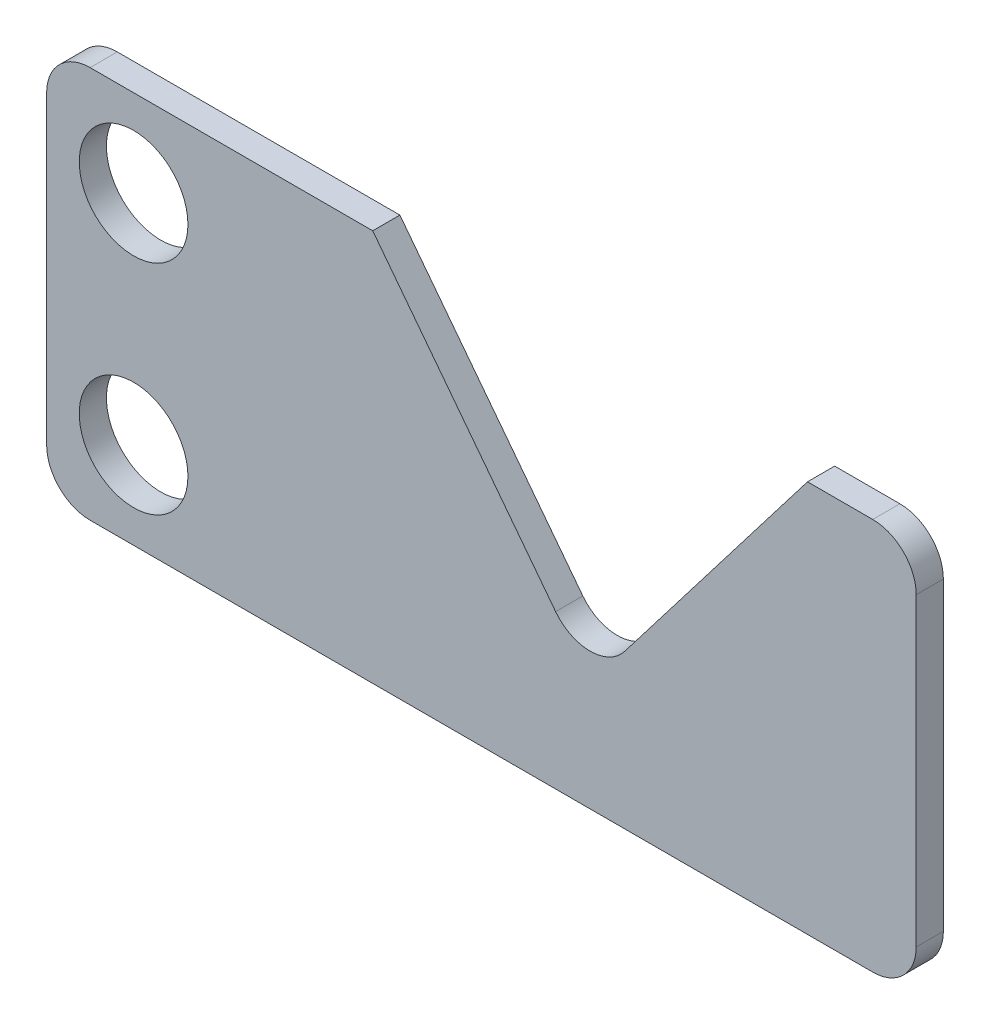
ISO-10303-21;
HEADER;
FILE_DESCRIPTION(('STEP AP214'),'2;1');
FILE_NAME('part.step','',(''),(''),'','','');
FILE_SCHEMA(('AUTOMOTIVE_DESIGN { 1 0 10303 214 1 1 1 1 }'));
ENDSEC;
DATA;
#1=APPLICATION_CONTEXT('core data for automotive mechanical design processes');
#2=APPLICATION_PROTOCOL_DEFINITION('international standard','automotive_design',2000,#1);
#3=PRODUCT_CONTEXT('',#1,'mechanical');
#4=PRODUCT('Part','Part','',(#3));
#5=PRODUCT_RELATED_PRODUCT_CATEGORY('part','',(#4));
#6=PRODUCT_DEFINITION_FORMATION('','',#4);
#7=PRODUCT_DEFINITION_CONTEXT('part definition',#1,'design');
#8=PRODUCT_DEFINITION('design','',#6,#7);
#9=PRODUCT_DEFINITION_SHAPE('','',#8);
#10=(LENGTH_UNIT() NAMED_UNIT(*) SI_UNIT(.MILLI.,.METRE.));
#11=(NAMED_UNIT(*) PLANE_ANGLE_UNIT() SI_UNIT($,.RADIAN.));
#12=(NAMED_UNIT(*) SI_UNIT($,.STERADIAN.) SOLID_ANGLE_UNIT());
#13=UNCERTAINTY_MEASURE_WITH_UNIT(LENGTH_MEASURE(1.E-05),#10,'distance_accuracy_value','');
#14=(GEOMETRIC_REPRESENTATION_CONTEXT(3) GLOBAL_UNCERTAINTY_ASSIGNED_CONTEXT((#13)) GLOBAL_UNIT_ASSIGNED_CONTEXT((#10,
#11,#12)) REPRESENTATION_CONTEXT('',''));
#15=CARTESIAN_POINT('',(0.,0.,0.));
#16=DIRECTION('',(0.,0.,1.));
#17=DIRECTION('',(1.,0.,0.));
#18=AXIS2_PLACEMENT_3D('',#15,#16,#17);
#19=CARTESIAN_POINT('',(31.75,10.5224062645297,1.5875));
#20=DIRECTION('',(0.,0.,1.));
#21=DIRECTION('',(1.,0.,0.));
#22=AXIS2_PLACEMENT_3D('',#19,#20,#21);
#23=PLANE('',#22);
#24=CARTESIAN_POINT('',(5.08,5.08,1.5875));
#25=DIRECTION('',(0.,0.,1.));
#26=DIRECTION('',(1.,0.,0.));
#27=AXIS2_PLACEMENT_3D('',#24,#25,#26);
#28=CIRCLE('',#27,3.175);
#29=CARTESIAN_POINT('',(8.255,5.08,1.5875));
#30=VERTEX_POINT('',#29);
#31=EDGE_CURVE('E164',#30,#30,#28,.T.);
#32=ORIENTED_EDGE('',*,*,#31,.F.);
#33=EDGE_LOOP('',(#32));
#34=FACE_BOUND('',#33,.T.);
#35=DIRECTION('',(-1.,0.,0.));
#36=VECTOR('',#35,1.);
#37=CARTESIAN_POINT('',(2.54000000000002,22.9009622350834,1.5875));
#38=LINE('',#37,#36);
#39=CARTESIAN_POINT('',(19.05,22.9009622350834,1.5875));
#40=VERTEX_POINT('',#39);
#41=CARTESIAN_POINT('',(2.54000000000002,22.9009622350834,1.5875));
#42=VERTEX_POINT('',#41);
#43=EDGE_CURVE('E183',#40,#42,#38,.T.);
#44=ORIENTED_EDGE('',*,*,#43,.T.);
#45=CARTESIAN_POINT('',(2.54,20.3609622350834,1.5875));
#46=DIRECTION('',(0.,0.,1.));
#47=DIRECTION('',(-1.,0.,0.));
#48=AXIS2_PLACEMENT_3D('',#45,#46,#47);
#49=CIRCLE('',#48,2.54);
#50=CARTESIAN_POINT('',(0.,20.3609622350834,1.5875));
#51=VERTEX_POINT('',#50);
#52=EDGE_CURVE('E111',#42,#51,#49,.T.);
#53=ORIENTED_EDGE('',*,*,#52,.T.);
#54=DIRECTION('',(0.,-1.,0.));
#55=VECTOR('',#54,1.);
#56=CARTESIAN_POINT('',(0.,2.54000000000002,1.5875));
#57=LINE('',#56,#55);
#58=CARTESIAN_POINT('',(0.,2.54,1.5875));
#59=VERTEX_POINT('',#58);
#60=EDGE_CURVE('E210',#51,#59,#57,.T.);
#61=ORIENTED_EDGE('',*,*,#60,.T.);
#62=CARTESIAN_POINT('',(2.54,2.54,1.5875));
#63=DIRECTION('',(0.,0.,1.));
#64=DIRECTION('',(-1.,0.,0.));
#65=AXIS2_PLACEMENT_3D('',#62,#63,#64);
#66=CIRCLE('',#65,2.54);
#67=CARTESIAN_POINT('',(2.54000000000002,0.,1.5875));
#68=VERTEX_POINT('',#67);
#69=EDGE_CURVE('E229',#59,#68,#66,.T.);
#70=ORIENTED_EDGE('',*,*,#69,.T.);
#71=DIRECTION('',(1.,0.,0.));
#72=VECTOR('',#71,1.);
#73=CARTESIAN_POINT('',(2.54000000000002,0.,1.5875));
#74=LINE('',#73,#72);
#75=CARTESIAN_POINT('',(48.26,0.,1.5875));
#76=VERTEX_POINT('',#75);
#77=EDGE_CURVE('E226',#68,#76,#74,.T.);
#78=ORIENTED_EDGE('',*,*,#77,.T.);
#79=CARTESIAN_POINT('',(48.26,2.54,1.5875));
#80=DIRECTION('',(0.,0.,1.));
#81=DIRECTION('',(1.,0.,0.));
#82=AXIS2_PLACEMENT_3D('',#79,#80,#81);
#83=CIRCLE('',#82,2.54);
#84=CARTESIAN_POINT('',(50.8,2.54,1.5875));
#85=VERTEX_POINT('',#84);
#86=EDGE_CURVE('E228',#76,#85,#83,.T.);
#87=ORIENTED_EDGE('',*,*,#86,.T.);
#88=DIRECTION('',(0.,1.,0.));
#89=VECTOR('',#88,1.);
#90=CARTESIAN_POINT('',(50.8,2.54,1.5875));
#91=LINE('',#90,#89);
#92=CARTESIAN_POINT('',(50.8,20.3609622350834,1.5875));
#93=VERTEX_POINT('',#92);
#94=EDGE_CURVE('E231',#85,#93,#91,.T.);
#95=ORIENTED_EDGE('',*,*,#94,.T.);
#96=CARTESIAN_POINT('',(48.26,20.3609622350834,1.5875));
#97=DIRECTION('',(0.,0.,1.));
#98=DIRECTION('',(-1.,0.,0.));
#99=AXIS2_PLACEMENT_3D('',#96,#97,#98);
#100=CIRCLE('',#99,2.54);
#101=CARTESIAN_POINT('',(48.26,22.9009622350834,1.5875));
#102=VERTEX_POINT('',#101);
#103=EDGE_CURVE('E237',#93,#102,#100,.T.);
#104=ORIENTED_EDGE('',*,*,#103,.T.);
#105=DIRECTION('',(-1.,0.,0.));
#106=VECTOR('',#105,1.);
#107=CARTESIAN_POINT('',(44.45,22.9009622350834,1.5875));
#108=LINE('',#107,#106);
#109=CARTESIAN_POINT('',(44.45,22.9009622350834,1.5875));
#110=VERTEX_POINT('',#109);
#111=EDGE_CURVE('E142',#102,#110,#108,.T.);
#112=ORIENTED_EDGE('',*,*,#111,.T.);
#113=DIRECTION('',(-0.608761429008719,-0.793353340291236,0.));
#114=VECTOR('',#113,1.);
#115=CARTESIAN_POINT('',(33.7651174843397,8.97615223484752,1.5875));
#116=LINE('',#115,#114);
#117=CARTESIAN_POINT('',(33.7651174843397,8.97615223484753,1.5875));
#118=VERTEX_POINT('',#117);
#119=EDGE_CURVE('E136',#110,#118,#116,.T.);
#120=ORIENTED_EDGE('',*,*,#119,.T.);
#121=CARTESIAN_POINT('',(31.75,10.5224062645297,1.5875));
#122=DIRECTION('',(0.,0.,-1.));
#123=DIRECTION('',(1.,0.,0.));
#124=AXIS2_PLACEMENT_3D('',#121,#122,#123);
#125=CIRCLE('',#124,2.54);
#126=CARTESIAN_POINT('',(29.7348825156602,8.97615223484752,1.5875));
#127=VERTEX_POINT('',#126);
#128=EDGE_CURVE('E140',#118,#127,#125,.T.);
#129=ORIENTED_EDGE('',*,*,#128,.T.);
#130=DIRECTION('',(-0.608761429008719,0.793353340291236,0.));
#131=VECTOR('',#130,1.);
#132=CARTESIAN_POINT('',(19.05,22.9009622350834,1.5875));
#133=LINE('',#132,#131);
#134=EDGE_CURVE('E56',#127,#40,#133,.T.);
#135=ORIENTED_EDGE('',*,*,#134,.T.);
#136=EDGE_LOOP('',(#44,#53,#61,#70,#78,#87,#95,#104,#112,#120,#129,#135));
#137=FACE_BOUND('',#136,.T.);
#138=CARTESIAN_POINT('',(5.08,17.8209622350834,1.5875));
#139=DIRECTION('',(0.,0.,1.));
#140=DIRECTION('',(1.,0.,0.));
#141=AXIS2_PLACEMENT_3D('',#138,#139,#140);
#142=CIRCLE('',#141,3.175);
#143=CARTESIAN_POINT('',(8.255,17.8209622350834,1.5875));
#144=VERTEX_POINT('',#143);
#145=EDGE_CURVE('E279',#144,#144,#142,.T.);
#146=ORIENTED_EDGE('',*,*,#145,.F.);
#147=EDGE_LOOP('',(#146));
#148=FACE_BOUND('',#147,.T.);
#149=ADVANCED_FACE('F39',(#34,#137,#148),#23,.T.);
#150=CARTESIAN_POINT('',(31.75,10.5224062645297,0.));
#151=DIRECTION('',(0.,0.,1.));
#152=DIRECTION('',(1.,0.,0.));
#153=AXIS2_PLACEMENT_3D('',#150,#151,#152);
#154=PLANE('',#153);
#155=DIRECTION('',(-1.,0.,0.));
#156=VECTOR('',#155,1.);
#157=CARTESIAN_POINT('',(2.54000000000002,22.9009622350834,0.));
#158=LINE('',#157,#156);
#159=CARTESIAN_POINT('',(19.05,22.9009622350834,0.));
#160=VERTEX_POINT('',#159);
#161=CARTESIAN_POINT('',(2.54000000000002,22.9009622350834,0.));
#162=VERTEX_POINT('',#161);
#163=EDGE_CURVE('E160',#160,#162,#158,.T.);
#164=ORIENTED_EDGE('',*,*,#163,.F.);
#165=DIRECTION('',(-0.608761429008719,0.793353340291236,0.));
#166=VECTOR('',#165,1.);
#167=CARTESIAN_POINT('',(19.05,22.9009622350834,0.));
#168=LINE('',#167,#166);
#169=CARTESIAN_POINT('',(29.7348825156602,8.97615223484752,0.));
#170=VERTEX_POINT('',#169);
#171=EDGE_CURVE('E103',#170,#160,#168,.T.);
#172=ORIENTED_EDGE('',*,*,#171,.F.);
#173=CARTESIAN_POINT('',(31.75,10.5224062645297,0.));
#174=DIRECTION('',(0.,0.,-1.));
#175=DIRECTION('',(1.,0.,0.));
#176=AXIS2_PLACEMENT_3D('',#173,#174,#175);
#177=CIRCLE('',#176,2.54);
#178=CARTESIAN_POINT('',(33.7651174843397,8.97615223484753,0.));
#179=VERTEX_POINT('',#178);
#180=EDGE_CURVE('E97',#179,#170,#177,.T.);
#181=ORIENTED_EDGE('',*,*,#180,.F.);
#182=DIRECTION('',(-0.608761429008719,-0.793353340291236,0.));
#183=VECTOR('',#182,1.);
#184=CARTESIAN_POINT('',(33.7651174843397,8.97615223484752,0.));
#185=LINE('',#184,#183);
#186=CARTESIAN_POINT('',(44.45,22.9009622350834,0.));
#187=VERTEX_POINT('',#186);
#188=EDGE_CURVE('E150',#187,#179,#185,.T.);
#189=ORIENTED_EDGE('',*,*,#188,.F.);
#190=DIRECTION('',(-1.,0.,0.));
#191=VECTOR('',#190,1.);
#192=CARTESIAN_POINT('',(44.45,22.9009622350834,0.));
#193=LINE('',#192,#191);
#194=CARTESIAN_POINT('',(48.26,22.9009622350834,0.));
#195=VERTEX_POINT('',#194);
#196=EDGE_CURVE('E178',#195,#187,#193,.T.);
#197=ORIENTED_EDGE('',*,*,#196,.F.);
#198=CARTESIAN_POINT('',(48.26,20.3609622350834,0.));
#199=DIRECTION('',(0.,0.,1.));
#200=DIRECTION('',(-1.,0.,0.));
#201=AXIS2_PLACEMENT_3D('',#198,#199,#200);
#202=CIRCLE('',#201,2.54);
#203=CARTESIAN_POINT('',(50.8,20.3609622350834,0.));
#204=VERTEX_POINT('',#203);
#205=EDGE_CURVE('E176',#204,#195,#202,.T.);
#206=ORIENTED_EDGE('',*,*,#205,.F.);
#207=DIRECTION('',(0.,1.,0.));
#208=VECTOR('',#207,1.);
#209=CARTESIAN_POINT('',(50.8,2.54,0.));
#210=LINE('',#209,#208);
#211=CARTESIAN_POINT('',(50.8,2.54,0.));
#212=VERTEX_POINT('',#211);
#213=EDGE_CURVE('E174',#212,#204,#210,.T.);
#214=ORIENTED_EDGE('',*,*,#213,.F.);
#215=CARTESIAN_POINT('',(48.26,2.54,0.));
#216=DIRECTION('',(0.,0.,1.));
#217=DIRECTION('',(1.,0.,0.));
#218=AXIS2_PLACEMENT_3D('',#215,#216,#217);
#219=CIRCLE('',#218,2.54);
#220=CARTESIAN_POINT('',(48.26,0.,0.));
#221=VERTEX_POINT('',#220);
#222=EDGE_CURVE('E172',#221,#212,#219,.T.);
#223=ORIENTED_EDGE('',*,*,#222,.F.);
#224=DIRECTION('',(1.,0.,0.));
#225=VECTOR('',#224,1.);
#226=CARTESIAN_POINT('',(2.54000000000002,0.,0.));
#227=LINE('',#226,#225);
#228=CARTESIAN_POINT('',(2.54000000000002,0.,0.));
#229=VERTEX_POINT('',#228);
#230=EDGE_CURVE('E170',#229,#221,#227,.T.);
#231=ORIENTED_EDGE('',*,*,#230,.F.);
#232=CARTESIAN_POINT('',(2.54,2.54,0.));
#233=DIRECTION('',(0.,0.,1.));
#234=DIRECTION('',(-1.,0.,0.));
#235=AXIS2_PLACEMENT_3D('',#232,#233,#234);
#236=CIRCLE('',#235,2.54);
#237=CARTESIAN_POINT('',(0.,2.54,0.));
#238=VERTEX_POINT('',#237);
#239=EDGE_CURVE('E168',#238,#229,#236,.T.);
#240=ORIENTED_EDGE('',*,*,#239,.F.);
#241=DIRECTION('',(0.,-1.,0.));
#242=VECTOR('',#241,1.);
#243=CARTESIAN_POINT('',(0.,2.54000000000002,0.));
#244=LINE('',#243,#242);
#245=CARTESIAN_POINT('',(0.,20.3609622350834,0.));
#246=VERTEX_POINT('',#245);
#247=EDGE_CURVE('E166',#246,#238,#244,.T.);
#248=ORIENTED_EDGE('',*,*,#247,.F.);
#249=CARTESIAN_POINT('',(2.54,20.3609622350834,0.));
#250=DIRECTION('',(0.,0.,1.));
#251=DIRECTION('',(-1.,0.,0.));
#252=AXIS2_PLACEMENT_3D('',#249,#250,#251);
#253=CIRCLE('',#252,2.54);
#254=EDGE_CURVE('E163',#162,#246,#253,.T.);
#255=ORIENTED_EDGE('',*,*,#254,.F.);
#256=EDGE_LOOP('',(#164,#172,#181,#189,#197,#206,#214,#223,#231,#240,#248,#255));
#257=FACE_BOUND('',#256,.T.);
#258=CARTESIAN_POINT('',(5.08,5.08,0.));
#259=DIRECTION('',(0.,0.,1.));
#260=DIRECTION('',(1.,0.,0.));
#261=AXIS2_PLACEMENT_3D('',#258,#259,#260);
#262=CIRCLE('',#261,3.175);
#263=CARTESIAN_POINT('',(8.255,5.08,0.));
#264=VERTEX_POINT('',#263);
#265=EDGE_CURVE('E285',#264,#264,#262,.T.);
#266=ORIENTED_EDGE('',*,*,#265,.T.);
#267=EDGE_LOOP('',(#266));
#268=FACE_BOUND('',#267,.T.);
#269=CARTESIAN_POINT('',(5.08,17.8209622350834,0.));
#270=DIRECTION('',(0.,0.,1.));
#271=DIRECTION('',(1.,0.,0.));
#272=AXIS2_PLACEMENT_3D('',#269,#270,#271);
#273=CIRCLE('',#272,3.175);
#274=CARTESIAN_POINT('',(8.255,17.8209622350834,0.));
#275=VERTEX_POINT('',#274);
#276=EDGE_CURVE('E282',#275,#275,#273,.T.);
#277=ORIENTED_EDGE('',*,*,#276,.T.);
#278=EDGE_LOOP('',(#277));
#279=FACE_BOUND('',#278,.T.);
#280=ADVANCED_FACE('F214',(#257,#268,#279),#154,.F.);
#281=CARTESIAN_POINT('',(2.54000000000002,22.9009622350834,1.5875));
#282=DIRECTION('',(0.,-1.,0.));
#283=DIRECTION('',(0.,0.,-1.));
#284=AXIS2_PLACEMENT_3D('',#281,#282,#283);
#285=PLANE('',#284);
#286=ORIENTED_EDGE('',*,*,#163,.T.);
#287=DIRECTION('',(0.,0.,-1.));
#288=VECTOR('',#287,1.);
#289=CARTESIAN_POINT('',(2.54000000000002,22.9009622350834,1.5875));
#290=LINE('',#289,#288);
#291=EDGE_CURVE('E11',#42,#162,#290,.T.);
#292=ORIENTED_EDGE('',*,*,#291,.F.);
#293=ORIENTED_EDGE('',*,*,#43,.F.);
#294=DIRECTION('',(0.,0.,-1.));
#295=VECTOR('',#294,1.);
#296=CARTESIAN_POINT('',(19.05,22.9009622350834,1.5875));
#297=LINE('',#296,#295);
#298=EDGE_CURVE('E156',#40,#160,#297,.T.);
#299=ORIENTED_EDGE('',*,*,#298,.T.);
#300=EDGE_LOOP('',(#286,#292,#293,#299));
#301=FACE_BOUND('',#300,.T.);
#302=ADVANCED_FACE('F41',(#301),#285,.F.);
#303=CARTESIAN_POINT('',(2.54,20.3609622350834,1.5875));
#304=DIRECTION('',(0.,0.,-1.));
#305=DIRECTION('',(-1.,0.,0.));
#306=AXIS2_PLACEMENT_3D('',#303,#304,#305);
#307=CYLINDRICAL_SURFACE('',#306,2.54);
#308=ORIENTED_EDGE('',*,*,#254,.T.);
#309=DIRECTION('',(0.,0.,-1.));
#310=VECTOR('',#309,1.);
#311=CARTESIAN_POINT('',(0.,20.3609622350834,1.5875));
#312=LINE('',#311,#310);
#313=EDGE_CURVE('E48',#51,#246,#312,.T.);
#314=ORIENTED_EDGE('',*,*,#313,.F.);
#315=ORIENTED_EDGE('',*,*,#52,.F.);
#316=ORIENTED_EDGE('',*,*,#291,.T.);
#317=EDGE_LOOP('',(#308,#314,#315,#316));
#318=FACE_BOUND('',#317,.T.);
#319=ADVANCED_FACE('F380',(#318),#307,.T.);
#320=CARTESIAN_POINT('',(0.,2.54000000000002,1.5875));
#321=DIRECTION('',(1.,0.,0.));
#322=DIRECTION('',(0.,0.,-1.));
#323=AXIS2_PLACEMENT_3D('',#320,#321,#322);
#324=PLANE('',#323);
#325=ORIENTED_EDGE('',*,*,#247,.T.);
#326=DIRECTION('',(0.,0.,-1.));
#327=VECTOR('',#326,1.);
#328=CARTESIAN_POINT('',(0.,2.54,1.5875));
#329=LINE('',#328,#327);
#330=EDGE_CURVE('E202',#59,#238,#329,.T.);
#331=ORIENTED_EDGE('',*,*,#330,.F.);
#332=ORIENTED_EDGE('',*,*,#60,.F.);
#333=ORIENTED_EDGE('',*,*,#313,.T.);
#334=EDGE_LOOP('',(#325,#331,#332,#333));
#335=FACE_BOUND('',#334,.T.);
#336=ADVANCED_FACE('F208',(#335),#324,.F.);
#337=CARTESIAN_POINT('',(2.54,2.54,1.5875));
#338=DIRECTION('',(0.,0.,-1.));
#339=DIRECTION('',(-1.,0.,0.));
#340=AXIS2_PLACEMENT_3D('',#337,#338,#339);
#341=CYLINDRICAL_SURFACE('',#340,2.54);
#342=ORIENTED_EDGE('',*,*,#239,.T.);
#343=DIRECTION('',(0.,0.,-1.));
#344=VECTOR('',#343,1.);
#345=CARTESIAN_POINT('',(2.54000000000002,0.,1.5875));
#346=LINE('',#345,#344);
#347=EDGE_CURVE('E199',#68,#229,#346,.T.);
#348=ORIENTED_EDGE('',*,*,#347,.F.);
#349=ORIENTED_EDGE('',*,*,#69,.F.);
#350=ORIENTED_EDGE('',*,*,#330,.T.);
#351=EDGE_LOOP('',(#342,#348,#349,#350));
#352=FACE_BOUND('',#351,.T.);
#353=ADVANCED_FACE('F220',(#352),#341,.T.);
#354=CARTESIAN_POINT('',(2.54000000000002,0.,1.5875));
#355=DIRECTION('',(0.,1.,0.));
#356=DIRECTION('',(0.,0.,1.));
#357=AXIS2_PLACEMENT_3D('',#354,#355,#356);
#358=PLANE('',#357);
#359=ORIENTED_EDGE('',*,*,#230,.T.);
#360=DIRECTION('',(0.,0.,-1.));
#361=VECTOR('',#360,1.);
#362=CARTESIAN_POINT('',(48.26,0.,1.5875));
#363=LINE('',#362,#361);
#364=EDGE_CURVE('E196',#76,#221,#363,.T.);
#365=ORIENTED_EDGE('',*,*,#364,.F.);
#366=ORIENTED_EDGE('',*,*,#77,.F.);
#367=ORIENTED_EDGE('',*,*,#347,.T.);
#368=EDGE_LOOP('',(#359,#365,#366,#367));
#369=FACE_BOUND('',#368,.T.);
#370=ADVANCED_FACE('F224',(#369),#358,.F.);
#371=CARTESIAN_POINT('',(48.26,2.54,1.5875));
#372=DIRECTION('',(0.,0.,-1.));
#373=DIRECTION('',(-1.,0.,0.));
#374=AXIS2_PLACEMENT_3D('',#371,#372,#373);
#375=CYLINDRICAL_SURFACE('',#374,2.54);
#376=ORIENTED_EDGE('',*,*,#222,.T.);
#377=DIRECTION('',(0.,0.,-1.));
#378=VECTOR('',#377,1.);
#379=CARTESIAN_POINT('',(50.8,2.54,1.5875));
#380=LINE('',#379,#378);
#381=EDGE_CURVE('E193',#85,#212,#380,.T.);
#382=ORIENTED_EDGE('',*,*,#381,.F.);
#383=ORIENTED_EDGE('',*,*,#86,.F.);
#384=ORIENTED_EDGE('',*,*,#364,.T.);
#385=EDGE_LOOP('',(#376,#382,#383,#384));
#386=FACE_BOUND('',#385,.T.);
#387=ADVANCED_FACE('F345',(#386),#375,.T.);
#388=CARTESIAN_POINT('',(50.8,2.54,1.5875));
#389=DIRECTION('',(-1.,0.,0.));
#390=DIRECTION('',(0.,0.,1.));
#391=AXIS2_PLACEMENT_3D('',#388,#389,#390);
#392=PLANE('',#391);
#393=ORIENTED_EDGE('',*,*,#213,.T.);
#394=DIRECTION('',(0.,0.,-1.));
#395=VECTOR('',#394,1.);
#396=CARTESIAN_POINT('',(50.8,20.3609622350834,1.5875));
#397=LINE('',#396,#395);
#398=EDGE_CURVE('E190',#93,#204,#397,.T.);
#399=ORIENTED_EDGE('',*,*,#398,.F.);
#400=ORIENTED_EDGE('',*,*,#94,.F.);
#401=ORIENTED_EDGE('',*,*,#381,.T.);
#402=EDGE_LOOP('',(#393,#399,#400,#401));
#403=FACE_BOUND('',#402,.T.);
#404=ADVANCED_FACE('F336',(#403),#392,.F.);
#405=CARTESIAN_POINT('',(48.26,20.3609622350834,1.5875));
#406=DIRECTION('',(0.,0.,-1.));
#407=DIRECTION('',(-1.,0.,0.));
#408=AXIS2_PLACEMENT_3D('',#405,#406,#407);
#409=CYLINDRICAL_SURFACE('',#408,2.54);
#410=ORIENTED_EDGE('',*,*,#205,.T.);
#411=DIRECTION('',(0.,0.,-1.));
#412=VECTOR('',#411,1.);
#413=CARTESIAN_POINT('',(48.26,22.9009622350834,1.5875));
#414=LINE('',#413,#412);
#415=EDGE_CURVE('E187',#102,#195,#414,.T.);
#416=ORIENTED_EDGE('',*,*,#415,.F.);
#417=ORIENTED_EDGE('',*,*,#103,.F.);
#418=ORIENTED_EDGE('',*,*,#398,.T.);
#419=EDGE_LOOP('',(#410,#416,#417,#418));
#420=FACE_BOUND('',#419,.T.);
#421=ADVANCED_FACE('F243',(#420),#409,.T.);
#422=CARTESIAN_POINT('',(44.45,22.9009622350834,1.5875));
#423=DIRECTION('',(0.,-1.,0.));
#424=DIRECTION('',(0.,0.,-1.));
#425=AXIS2_PLACEMENT_3D('',#422,#423,#424);
#426=PLANE('',#425);
#427=ORIENTED_EDGE('',*,*,#196,.T.);
#428=DIRECTION('',(0.,0.,-1.));
#429=VECTOR('',#428,1.);
#430=CARTESIAN_POINT('',(44.45,22.9009622350834,1.5875));
#431=LINE('',#430,#429);
#432=EDGE_CURVE('E151',#110,#187,#431,.T.);
#433=ORIENTED_EDGE('',*,*,#432,.F.);
#434=ORIENTED_EDGE('',*,*,#111,.F.);
#435=ORIENTED_EDGE('',*,*,#415,.T.);
#436=EDGE_LOOP('',(#427,#433,#434,#435));
#437=FACE_BOUND('',#436,.T.);
#438=ADVANCED_FACE('F247',(#437),#426,.F.);
#439=CARTESIAN_POINT('',(33.7651174843397,8.97615223484752,1.5875));
#440=DIRECTION('',(0.793353340291236,-0.608761429008719,0.));
#441=DIRECTION('',(0.608761429008719,0.793353340291237,0.));
#442=AXIS2_PLACEMENT_3D('',#439,#440,#441);
#443=PLANE('',#442);
#444=ORIENTED_EDGE('',*,*,#188,.T.);
#445=DIRECTION('',(0.,0.,-1.));
#446=VECTOR('',#445,1.);
#447=CARTESIAN_POINT('',(33.7651174843397,8.97615223484753,1.5875));
#448=LINE('',#447,#446);
#449=EDGE_CURVE('E147',#118,#179,#448,.T.);
#450=ORIENTED_EDGE('',*,*,#449,.F.);
#451=ORIENTED_EDGE('',*,*,#119,.F.);
#452=ORIENTED_EDGE('',*,*,#432,.T.);
#453=EDGE_LOOP('',(#444,#450,#451,#452));
#454=FACE_BOUND('',#453,.T.);
#455=ADVANCED_FACE('F148',(#454),#443,.F.);
#456=CARTESIAN_POINT('',(31.75,10.5224062645297,1.5875));
#457=DIRECTION('',(0.,0.,-1.));
#458=DIRECTION('',(-1.,0.,0.));
#459=AXIS2_PLACEMENT_3D('',#456,#457,#458);
#460=CYLINDRICAL_SURFACE('',#459,2.54);
#461=ORIENTED_EDGE('',*,*,#180,.T.);
#462=DIRECTION('',(0.,0.,-1.));
#463=VECTOR('',#462,1.);
#464=CARTESIAN_POINT('',(29.7348825156602,8.97615223484752,1.5875));
#465=LINE('',#464,#463);
#466=EDGE_CURVE('E152',#127,#170,#465,.T.);
#467=ORIENTED_EDGE('',*,*,#466,.F.);
#468=ORIENTED_EDGE('',*,*,#128,.F.);
#469=ORIENTED_EDGE('',*,*,#449,.T.);
#470=EDGE_LOOP('',(#461,#467,#468,#469));
#471=FACE_BOUND('',#470,.T.);
#472=ADVANCED_FACE('F154',(#471),#460,.F.);
#473=CARTESIAN_POINT('',(19.05,22.9009622350834,1.5875));
#474=DIRECTION('',(-0.793353340291236,-0.608761429008719,0.));
#475=DIRECTION('',(0.608761429008719,-0.793353340291237,0.));
#476=AXIS2_PLACEMENT_3D('',#473,#474,#475);
#477=PLANE('',#476);
#478=ORIENTED_EDGE('',*,*,#171,.T.);
#479=ORIENTED_EDGE('',*,*,#298,.F.);
#480=ORIENTED_EDGE('',*,*,#134,.F.);
#481=ORIENTED_EDGE('',*,*,#466,.T.);
#482=EDGE_LOOP('',(#478,#479,#480,#481));
#483=FACE_BOUND('',#482,.T.);
#484=ADVANCED_FACE('F251',(#483),#477,.F.);
#485=CARTESIAN_POINT('',(5.08,5.08,1.5875));
#486=DIRECTION('',(0.,0.,-1.));
#487=DIRECTION('',(-1.,0.,0.));
#488=AXIS2_PLACEMENT_3D('',#485,#486,#487);
#489=CYLINDRICAL_SURFACE('',#488,3.175);
#490=ORIENTED_EDGE('',*,*,#31,.T.);
#491=EDGE_LOOP('',(#490));
#492=FACE_BOUND('',#491,.T.);
#493=ORIENTED_EDGE('',*,*,#265,.F.);
#494=EDGE_LOOP('',(#493));
#495=FACE_BOUND('',#494,.T.);
#496=ADVANCED_FACE('F253',(#492,#495),#489,.F.);
#497=CARTESIAN_POINT('',(5.08,17.8209622350834,1.5875));
#498=DIRECTION('',(0.,0.,-1.));
#499=DIRECTION('',(-1.,0.,0.));
#500=AXIS2_PLACEMENT_3D('',#497,#498,#499);
#501=CYLINDRICAL_SURFACE('',#500,3.175);
#502=ORIENTED_EDGE('',*,*,#145,.T.);
#503=EDGE_LOOP('',(#502));
#504=FACE_BOUND('',#503,.T.);
#505=ORIENTED_EDGE('',*,*,#276,.F.);
#506=EDGE_LOOP('',(#505));
#507=FACE_BOUND('',#506,.T.);
#508=ADVANCED_FACE('F259',(#504,#507),#501,.F.);
#509=CLOSED_SHELL('',(#149,#280,#302,#319,#336,#353,#370,#387,#404,#421,#438,#455,#472,#484,
#496,#508));
#510=MANIFOLD_SOLID_BREP('B2',#509);
#511=ADVANCED_BREP_SHAPE_REPRESENTATION('',(#18,#510),#14);
#512=SHAPE_DEFINITION_REPRESENTATION(#9,#511);
ENDSEC;
END-ISO-10303-21;
